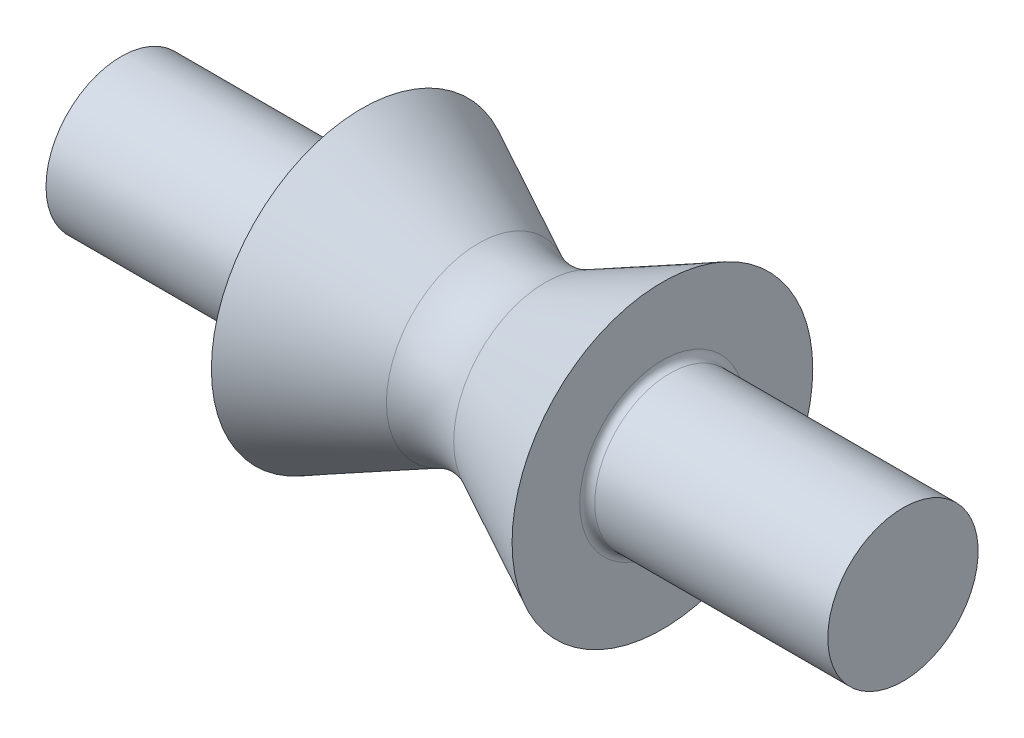
ISO-10303-21;
HEADER;
FILE_DESCRIPTION(('STEP AP214'),'2;1');
FILE_NAME('part.step','',(''),(''),'','','');
FILE_SCHEMA(('AUTOMOTIVE_DESIGN { 1 0 10303 214 1 1 1 1 }'));
ENDSEC;
DATA;
#1=APPLICATION_CONTEXT('core data for automotive mechanical design processes');
#2=APPLICATION_PROTOCOL_DEFINITION('international standard','automotive_design',2000,#1);
#3=PRODUCT_CONTEXT('',#1,'mechanical');
#4=PRODUCT('Part','Part','',(#3));
#5=PRODUCT_RELATED_PRODUCT_CATEGORY('part','',(#4));
#6=PRODUCT_DEFINITION_FORMATION('','',#4);
#7=PRODUCT_DEFINITION_CONTEXT('part definition',#1,'design');
#8=PRODUCT_DEFINITION('design','',#6,#7);
#9=PRODUCT_DEFINITION_SHAPE('','',#8);
#10=(LENGTH_UNIT() NAMED_UNIT(*) SI_UNIT(.MILLI.,.METRE.));
#11=(NAMED_UNIT(*) PLANE_ANGLE_UNIT() SI_UNIT($,.RADIAN.));
#12=(NAMED_UNIT(*) SI_UNIT($,.STERADIAN.) SOLID_ANGLE_UNIT());
#13=UNCERTAINTY_MEASURE_WITH_UNIT(LENGTH_MEASURE(1.E-05),#10,'distance_accuracy_value','');
#14=(GEOMETRIC_REPRESENTATION_CONTEXT(3) GLOBAL_UNCERTAINTY_ASSIGNED_CONTEXT((#13)) GLOBAL_UNIT_ASSIGNED_CONTEXT((#10,
#11,#12)) REPRESENTATION_CONTEXT('',''));
#15=CARTESIAN_POINT('',(0.,0.,0.));
#16=DIRECTION('',(0.,0.,1.));
#17=DIRECTION('',(1.,0.,0.));
#18=AXIS2_PLACEMENT_3D('',#15,#16,#17);
#19=CARTESIAN_POINT('',(0.,0.,0.));
#20=DIRECTION('',(1.,0.,0.));
#21=DIRECTION('',(0.,0.,-1.));
#22=AXIS2_PLACEMENT_3D('',#19,#20,#21);
#23=PLANE('',#22);
#24=CARTESIAN_POINT('',(0.,0.,0.));
#25=DIRECTION('',(-1.,0.,0.));
#26=DIRECTION('',(0.,0.,1.));
#27=AXIS2_PLACEMENT_3D('',#24,#25,#26);
#28=CIRCLE('',#27,10.);
#29=CARTESIAN_POINT('',(0.,0.,10.));
#30=VERTEX_POINT('',#29);
#31=EDGE_CURVE('E75',#30,#30,#28,.T.);
#32=ORIENTED_EDGE('',*,*,#31,.T.);
#33=EDGE_LOOP('',(#32));
#34=FACE_BOUND('',#33,.T.);
#35=ADVANCED_FACE('F43',(#34),#23,.F.);
#36=CARTESIAN_POINT('',(0.,0.,0.));
#37=DIRECTION('',(-1.,0.,0.));
#38=DIRECTION('',(0.,0.,1.));
#39=AXIS2_PLACEMENT_3D('',#36,#37,#38);
#40=CYLINDRICAL_SURFACE('',#39,10.);
#41=CARTESIAN_POINT('',(31.,0.,0.));
#42=DIRECTION('',(1.,0.,0.));
#43=DIRECTION('',(0.,0.,-1.));
#44=AXIS2_PLACEMENT_3D('',#41,#42,#43);
#45=CIRCLE('',#44,10.);
#46=CARTESIAN_POINT('',(31.,0.,-10.));
#47=VERTEX_POINT('',#46);
#48=EDGE_CURVE('E61',#47,#47,#45,.F.);
#49=ORIENTED_EDGE('',*,*,#48,.T.);
#50=EDGE_LOOP('',(#49));
#51=FACE_BOUND('',#50,.T.);
#52=ORIENTED_EDGE('',*,*,#31,.F.);
#53=EDGE_LOOP('',(#52));
#54=FACE_BOUND('',#53,.T.);
#55=ADVANCED_FACE('F110',(#51,#54),#40,.T.);
#56=CARTESIAN_POINT('',(32.,10.,0.));
#57=DIRECTION('',(1.,0.,0.));
#58=DIRECTION('',(0.,0.,-1.));
#59=AXIS2_PLACEMENT_3D('',#56,#57,#58);
#60=PLANE('',#59);
#61=CARTESIAN_POINT('',(32.,0.,0.));
#62=DIRECTION('',(1.,0.,0.));
#63=DIRECTION('',(0.,0.,-1.));
#64=AXIS2_PLACEMENT_3D('',#61,#62,#63);
#65=CIRCLE('',#64,11.);
#66=CARTESIAN_POINT('',(32.,0.,-11.));
#67=VERTEX_POINT('',#66);
#68=EDGE_CURVE('E56',#67,#67,#65,.T.);
#69=ORIENTED_EDGE('',*,*,#68,.T.);
#70=EDGE_LOOP('',(#69));
#71=FACE_BOUND('',#70,.T.);
#72=CARTESIAN_POINT('',(32.,0.,0.));
#73=DIRECTION('',(-1.,0.,0.));
#74=DIRECTION('',(0.,0.,1.));
#75=AXIS2_PLACEMENT_3D('',#72,#73,#74);
#76=CIRCLE('',#75,20.);
#77=CARTESIAN_POINT('',(32.,0.,20.));
#78=VERTEX_POINT('',#77);
#79=EDGE_CURVE('E79',#78,#78,#76,.T.);
#80=ORIENTED_EDGE('',*,*,#79,.T.);
#81=EDGE_LOOP('',(#80));
#82=FACE_BOUND('',#81,.T.);
#83=ADVANCED_FACE('F115',(#71,#82),#60,.F.);
#84=CARTESIAN_POINT('',(52.,0.,0.));
#85=DIRECTION('',(-1.,0.,0.));
#86=DIRECTION('',(0.,0.,1.));
#87=AXIS2_PLACEMENT_3D('',#84,#85,#86);
#88=CONICAL_SURFACE('',#87,10.,0.463647609000806);
#89=CARTESIAN_POINT('',(47.5278640450004,0.,0.));
#90=DIRECTION('',(-1.,0.,0.));
#91=DIRECTION('',(0.,0.,1.));
#92=AXIS2_PLACEMENT_3D('',#89,#90,#91);
#93=CIRCLE('',#92,12.2360679774998);
#94=CARTESIAN_POINT('',(47.5278640450004,0.,12.2360679774998));
#95=VERTEX_POINT('',#94);
#96=EDGE_CURVE('E51',#95,#95,#93,.T.);
#97=ORIENTED_EDGE('',*,*,#96,.T.);
#98=EDGE_LOOP('',(#97));
#99=FACE_BOUND('',#98,.T.);
#100=ORIENTED_EDGE('',*,*,#79,.F.);
#101=EDGE_LOOP('',(#100));
#102=FACE_BOUND('',#101,.T.);
#103=ADVANCED_FACE('F134',(#99,#102),#88,.T.);
#104=CARTESIAN_POINT('',(72.,0.,0.));
#105=DIRECTION('',(1.,0.,0.));
#106=DIRECTION('',(0.,0.,-1.));
#107=AXIS2_PLACEMENT_3D('',#104,#105,#106);
#108=CONICAL_SURFACE('',#107,20.,0.463647609000807);
#109=CARTESIAN_POINT('',(56.4721359549996,0.,0.));
#110=DIRECTION('',(1.,0.,0.));
#111=DIRECTION('',(0.,0.,-1.));
#112=AXIS2_PLACEMENT_3D('',#109,#110,#111);
#113=CIRCLE('',#112,12.2360679774998);
#114=CARTESIAN_POINT('',(56.4721359549996,0.,-12.2360679774998));
#115=VERTEX_POINT('',#114);
#116=EDGE_CURVE('E10',#115,#115,#113,.T.);
#117=ORIENTED_EDGE('',*,*,#116,.T.);
#118=EDGE_LOOP('',(#117));
#119=FACE_BOUND('',#118,.T.);
#120=CARTESIAN_POINT('',(72.,0.,0.));
#121=DIRECTION('',(-1.,0.,0.));
#122=DIRECTION('',(0.,0.,1.));
#123=AXIS2_PLACEMENT_3D('',#120,#121,#122);
#124=CIRCLE('',#123,20.);
#125=CARTESIAN_POINT('',(72.,0.,20.));
#126=VERTEX_POINT('',#125);
#127=EDGE_CURVE('E83',#126,#126,#124,.T.);
#128=ORIENTED_EDGE('',*,*,#127,.T.);
#129=EDGE_LOOP('',(#128));
#130=FACE_BOUND('',#129,.T.);
#131=ADVANCED_FACE('F137',(#119,#130),#108,.T.);
#132=CARTESIAN_POINT('',(72.,20.,0.));
#133=DIRECTION('',(-1.,0.,0.));
#134=DIRECTION('',(0.,0.,1.));
#135=AXIS2_PLACEMENT_3D('',#132,#133,#134);
#136=PLANE('',#135);
#137=CARTESIAN_POINT('',(72.,0.,0.));
#138=DIRECTION('',(-1.,0.,0.));
#139=DIRECTION('',(0.,0.,1.));
#140=AXIS2_PLACEMENT_3D('',#137,#138,#139);
#141=CIRCLE('',#140,11.);
#142=CARTESIAN_POINT('',(72.,0.,11.));
#143=VERTEX_POINT('',#142);
#144=EDGE_CURVE('E71',#143,#143,#141,.T.);
#145=ORIENTED_EDGE('',*,*,#144,.T.);
#146=EDGE_LOOP('',(#145));
#147=FACE_BOUND('',#146,.T.);
#148=ORIENTED_EDGE('',*,*,#127,.F.);
#149=EDGE_LOOP('',(#148));
#150=FACE_BOUND('',#149,.T.);
#151=ADVANCED_FACE('F107',(#147,#150),#136,.F.);
#152=CARTESIAN_POINT('',(0.,0.,0.));
#153=DIRECTION('',(-1.,0.,0.));
#154=DIRECTION('',(0.,0.,1.));
#155=AXIS2_PLACEMENT_3D('',#152,#153,#154);
#156=CYLINDRICAL_SURFACE('',#155,10.);
#157=CARTESIAN_POINT('',(73.,0.,0.));
#158=DIRECTION('',(-1.,0.,0.));
#159=DIRECTION('',(0.,0.,1.));
#160=AXIS2_PLACEMENT_3D('',#157,#158,#159);
#161=CIRCLE('',#160,10.);
#162=CARTESIAN_POINT('',(73.,0.,10.));
#163=VERTEX_POINT('',#162);
#164=EDGE_CURVE('E67',#163,#163,#161,.F.);
#165=ORIENTED_EDGE('',*,*,#164,.T.);
#166=EDGE_LOOP('',(#165));
#167=FACE_BOUND('',#166,.T.);
#168=CARTESIAN_POINT('',(104.,0.,0.));
#169=DIRECTION('',(-1.,0.,0.));
#170=DIRECTION('',(0.,0.,1.));
#171=AXIS2_PLACEMENT_3D('',#168,#169,#170);
#172=CIRCLE('',#171,10.);
#173=CARTESIAN_POINT('',(104.,0.,10.));
#174=VERTEX_POINT('',#173);
#175=EDGE_CURVE('E87',#174,#174,#172,.T.);
#176=ORIENTED_EDGE('',*,*,#175,.T.);
#177=EDGE_LOOP('',(#176));
#178=FACE_BOUND('',#177,.T.);
#179=ADVANCED_FACE('F92',(#167,#178),#156,.T.);
#180=CARTESIAN_POINT('',(104.,10.,0.));
#181=DIRECTION('',(-1.,0.,0.));
#182=DIRECTION('',(0.,0.,1.));
#183=AXIS2_PLACEMENT_3D('',#180,#181,#182);
#184=PLANE('',#183);
#185=ORIENTED_EDGE('',*,*,#175,.F.);
#186=EDGE_LOOP('',(#185));
#187=FACE_BOUND('',#186,.T.);
#188=ADVANCED_FACE('F94',(#187),#184,.F.);
#189=CARTESIAN_POINT('',(73.,0.,0.));
#190=DIRECTION('',(-1.,0.,0.));
#191=DIRECTION('',(0.,0.,1.));
#192=AXIS2_PLACEMENT_3D('',#189,#190,#191);
#193=TOROIDAL_SURFACE('',#192,11.,1.);
#194=ORIENTED_EDGE('',*,*,#164,.F.);
#195=EDGE_LOOP('',(#194));
#196=FACE_BOUND('',#195,.T.);
#197=ORIENTED_EDGE('',*,*,#144,.F.);
#198=EDGE_LOOP('',(#197));
#199=FACE_BOUND('',#198,.T.);
#200=ADVANCED_FACE('F96',(#196,#199),#193,.F.);
#201=CARTESIAN_POINT('',(31.,0.,0.));
#202=DIRECTION('',(1.,0.,0.));
#203=DIRECTION('',(0.,0.,-1.));
#204=AXIS2_PLACEMENT_3D('',#201,#202,#203);
#205=TOROIDAL_SURFACE('',#204,11.,1.);
#206=ORIENTED_EDGE('',*,*,#68,.F.);
#207=EDGE_LOOP('',(#206));
#208=FACE_BOUND('',#207,.T.);
#209=ORIENTED_EDGE('',*,*,#48,.F.);
#210=EDGE_LOOP('',(#209));
#211=FACE_BOUND('',#210,.T.);
#212=ADVANCED_FACE('F103',(#208,#211),#205,.F.);
#213=CARTESIAN_POINT('',(52.,0.,0.));
#214=DIRECTION('',(-1.,0.,0.));
#215=DIRECTION('',(0.,0.,1.));
#216=AXIS2_PLACEMENT_3D('',#213,#214,#215);
#217=TOROIDAL_SURFACE('',#216,21.180339887499,10.);
#218=ORIENTED_EDGE('',*,*,#116,.F.);
#219=EDGE_LOOP('',(#218));
#220=FACE_BOUND('',#219,.T.);
#221=ORIENTED_EDGE('',*,*,#96,.F.);
#222=EDGE_LOOP('',(#221));
#223=FACE_BOUND('',#222,.T.);
#224=ADVANCED_FACE('F45',(#220,#223),#217,.F.);
#225=CLOSED_SHELL('',(#35,#55,#83,#103,#131,#151,#179,#188,#200,#212,#224));
#226=MANIFOLD_SOLID_BREP('B2',#225);
#227=ADVANCED_BREP_SHAPE_REPRESENTATION('',(#18,#226),#14);
#228=SHAPE_DEFINITION_REPRESENTATION(#9,#227);
ENDSEC;
END-ISO-10303-21;
